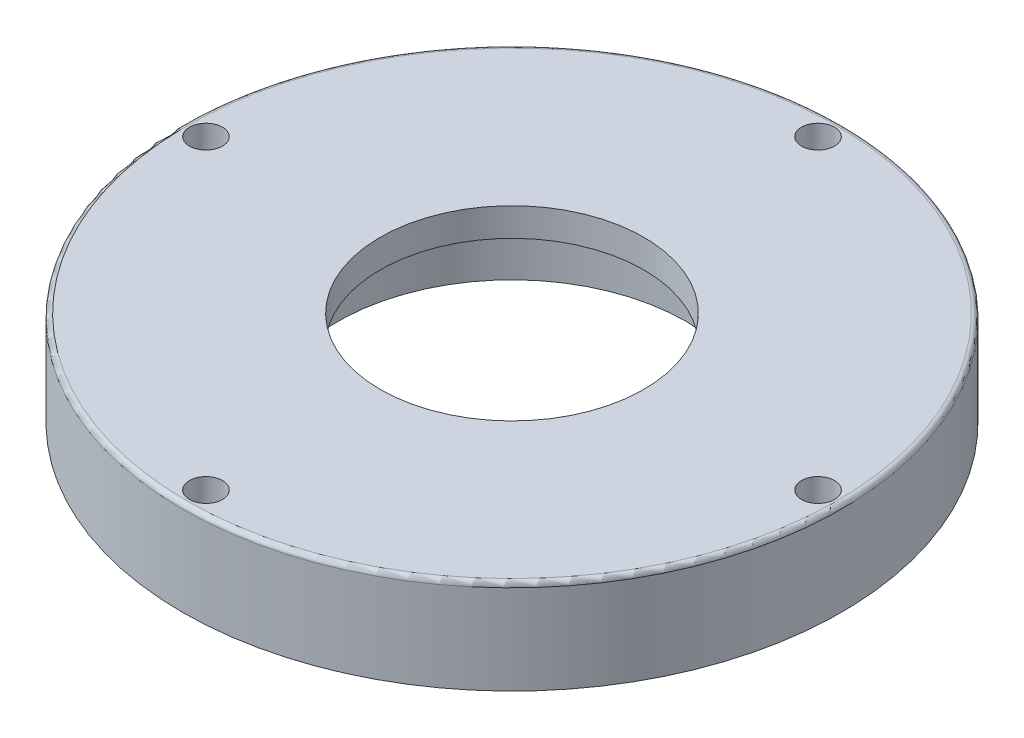
ISO-10303-21;
HEADER;
FILE_DESCRIPTION(('STEP AP214'),'2;1');
FILE_NAME('part.step','',(''),(''),'','','');
FILE_SCHEMA(('AUTOMOTIVE_DESIGN { 1 0 10303 214 1 1 1 1 }'));
ENDSEC;
DATA;
#1=APPLICATION_CONTEXT('core data for automotive mechanical design processes');
#2=APPLICATION_PROTOCOL_DEFINITION('international standard','automotive_design',2000,#1);
#3=PRODUCT_CONTEXT('',#1,'mechanical');
#4=PRODUCT('Part','Part','',(#3));
#5=PRODUCT_RELATED_PRODUCT_CATEGORY('part','',(#4));
#6=PRODUCT_DEFINITION_FORMATION('','',#4);
#7=PRODUCT_DEFINITION_CONTEXT('part definition',#1,'design');
#8=PRODUCT_DEFINITION('design','',#6,#7);
#9=PRODUCT_DEFINITION_SHAPE('','',#8);
#10=(LENGTH_UNIT() NAMED_UNIT(*) SI_UNIT(.MILLI.,.METRE.));
#11=(NAMED_UNIT(*) PLANE_ANGLE_UNIT() SI_UNIT($,.RADIAN.));
#12=(NAMED_UNIT(*) SI_UNIT($,.STERADIAN.) SOLID_ANGLE_UNIT());
#13=UNCERTAINTY_MEASURE_WITH_UNIT(LENGTH_MEASURE(1.E-05),#10,'distance_accuracy_value','');
#14=(GEOMETRIC_REPRESENTATION_CONTEXT(3) GLOBAL_UNCERTAINTY_ASSIGNED_CONTEXT((#13)) GLOBAL_UNIT_ASSIGNED_CONTEXT((#10,
#11,#12)) REPRESENTATION_CONTEXT('',''));
#15=CARTESIAN_POINT('',(0.,0.,0.));
#16=DIRECTION('',(0.,0.,1.));
#17=DIRECTION('',(1.,0.,0.));
#18=AXIS2_PLACEMENT_3D('',#15,#16,#17);
#19=CARTESIAN_POINT('',(0.,10.,0.));
#20=DIRECTION('',(0.,-1.,0.));
#21=DIRECTION('',(0.,0.,-1.));
#22=AXIS2_PLACEMENT_3D('',#19,#20,#21);
#23=CYLINDRICAL_SURFACE('',#22,35.);
#24=CARTESIAN_POINT('',(0.,9.5,0.));
#25=DIRECTION('',(0.,1.,0.));
#26=DIRECTION('',(0.,0.,1.));
#27=AXIS2_PLACEMENT_3D('',#24,#25,#26);
#28=CIRCLE('',#27,35.);
#29=CARTESIAN_POINT('',(0.,9.5,35.));
#30=VERTEX_POINT('',#29);
#31=EDGE_CURVE('E10',#30,#30,#28,.F.);
#32=ORIENTED_EDGE('',*,*,#31,.T.);
#33=EDGE_LOOP('',(#32));
#34=FACE_BOUND('',#33,.T.);
#35=CARTESIAN_POINT('',(0.,0.,0.));
#36=DIRECTION('',(0.,1.,0.));
#37=DIRECTION('',(0.,0.,1.));
#38=AXIS2_PLACEMENT_3D('',#35,#36,#37);
#39=CIRCLE('',#38,35.);
#40=CARTESIAN_POINT('',(0.,0.,35.));
#41=VERTEX_POINT('',#40);
#42=EDGE_CURVE('E45',#41,#41,#39,.T.);
#43=ORIENTED_EDGE('',*,*,#42,.T.);
#44=EDGE_LOOP('',(#43));
#45=FACE_BOUND('',#44,.T.);
#46=ADVANCED_FACE('F34',(#34,#45),#23,.T.);
#47=CARTESIAN_POINT('',(0.,10.,0.));
#48=DIRECTION('',(0.,1.,0.));
#49=DIRECTION('',(0.,0.,1.));
#50=AXIS2_PLACEMENT_3D('',#47,#48,#49);
#51=PLANE('',#50);
#52=CARTESIAN_POINT('',(0.,10.,0.));
#53=DIRECTION('',(0.,1.,0.));
#54=DIRECTION('',(0.,0.,1.));
#55=AXIS2_PLACEMENT_3D('',#52,#53,#54);
#56=CIRCLE('',#55,34.5);
#57=CARTESIAN_POINT('',(0.,10.,34.5));
#58=VERTEX_POINT('',#57);
#59=EDGE_CURVE('E41',#58,#58,#56,.T.);
#60=ORIENTED_EDGE('',*,*,#59,.T.);
#61=EDGE_LOOP('',(#60));
#62=FACE_BOUND('',#61,.T.);
#63=CARTESIAN_POINT('',(0.,10.,0.));
#64=DIRECTION('',(0.,1.,0.));
#65=DIRECTION('',(0.,0.,1.));
#66=AXIS2_PLACEMENT_3D('',#63,#64,#65);
#67=CIRCLE('',#66,14.);
#68=CARTESIAN_POINT('',(0.,10.,14.));
#69=VERTEX_POINT('',#68);
#70=EDGE_CURVE('E55',#69,#69,#67,.T.);
#71=ORIENTED_EDGE('',*,*,#70,.F.);
#72=EDGE_LOOP('',(#71));
#73=FACE_BOUND('',#72,.T.);
#74=CARTESIAN_POINT('',(0.,10.,-32.5));
#75=DIRECTION('',(0.,1.,0.));
#76=DIRECTION('',(0.,0.,1.));
#77=AXIS2_PLACEMENT_3D('',#74,#75,#76);
#78=CIRCLE('',#77,1.75);
#79=CARTESIAN_POINT('',(0.,10.,-30.75));
#80=VERTEX_POINT('',#79);
#81=EDGE_CURVE('E76',#80,#80,#78,.T.);
#82=ORIENTED_EDGE('',*,*,#81,.F.);
#83=EDGE_LOOP('',(#82));
#84=FACE_BOUND('',#83,.T.);
#85=CARTESIAN_POINT('',(32.5,10.,0.));
#86=DIRECTION('',(0.,1.,0.));
#87=DIRECTION('',(0.,0.,1.));
#88=AXIS2_PLACEMENT_3D('',#85,#86,#87);
#89=CIRCLE('',#88,1.75);
#90=CARTESIAN_POINT('',(32.5,10.,1.75));
#91=VERTEX_POINT('',#90);
#92=EDGE_CURVE('E70',#91,#91,#89,.T.);
#93=ORIENTED_EDGE('',*,*,#92,.F.);
#94=EDGE_LOOP('',(#93));
#95=FACE_BOUND('',#94,.T.);
#96=CARTESIAN_POINT('',(0.,10.,32.5));
#97=DIRECTION('',(0.,1.,0.));
#98=DIRECTION('',(0.,0.,1.));
#99=AXIS2_PLACEMENT_3D('',#96,#97,#98);
#100=CIRCLE('',#99,1.75);
#101=CARTESIAN_POINT('',(0.,10.,34.25));
#102=VERTEX_POINT('',#101);
#103=EDGE_CURVE('E64',#102,#102,#100,.T.);
#104=ORIENTED_EDGE('',*,*,#103,.F.);
#105=EDGE_LOOP('',(#104));
#106=FACE_BOUND('',#105,.T.);
#107=CARTESIAN_POINT('',(-32.5,10.,0.));
#108=DIRECTION('',(0.,1.,0.));
#109=DIRECTION('',(0.,0.,1.));
#110=AXIS2_PLACEMENT_3D('',#107,#108,#109);
#111=CIRCLE('',#110,1.75);
#112=CARTESIAN_POINT('',(-32.5,10.,1.75000000000001));
#113=VERTEX_POINT('',#112);
#114=EDGE_CURVE('E57',#113,#113,#111,.T.);
#115=ORIENTED_EDGE('',*,*,#114,.F.);
#116=EDGE_LOOP('',(#115));
#117=FACE_BOUND('',#116,.T.);
#118=ADVANCED_FACE('F90',(#62,#73,#84,#95,#106,#117),#51,.T.);
#119=CARTESIAN_POINT('',(0.,0.,0.));
#120=DIRECTION('',(0.,1.,0.));
#121=DIRECTION('',(0.,0.,1.));
#122=AXIS2_PLACEMENT_3D('',#119,#120,#121);
#123=PLANE('',#122);
#124=CARTESIAN_POINT('',(0.,0.,0.));
#125=DIRECTION('',(0.,-1.,0.));
#126=DIRECTION('',(0.,0.,-1.));
#127=AXIS2_PLACEMENT_3D('',#124,#125,#126);
#128=CIRCLE('',#127,18.5);
#129=CARTESIAN_POINT('',(0.,0.,-18.5));
#130=VERTEX_POINT('',#129);
#131=EDGE_CURVE('E54',#130,#130,#128,.T.);
#132=ORIENTED_EDGE('',*,*,#131,.F.);
#133=EDGE_LOOP('',(#132));
#134=FACE_BOUND('',#133,.T.);
#135=CARTESIAN_POINT('',(0.,0.,-32.5));
#136=DIRECTION('',(0.,1.,0.));
#137=DIRECTION('',(0.,0.,1.));
#138=AXIS2_PLACEMENT_3D('',#135,#136,#137);
#139=CIRCLE('',#138,1.75);
#140=CARTESIAN_POINT('',(0.,0.,-30.75));
#141=VERTEX_POINT('',#140);
#142=EDGE_CURVE('E49',#141,#141,#139,.T.);
#143=ORIENTED_EDGE('',*,*,#142,.T.);
#144=EDGE_LOOP('',(#143));
#145=FACE_BOUND('',#144,.T.);
#146=CARTESIAN_POINT('',(32.5,0.,0.));
#147=DIRECTION('',(0.,1.,0.));
#148=DIRECTION('',(0.,0.,1.));
#149=AXIS2_PLACEMENT_3D('',#146,#147,#148);
#150=CIRCLE('',#149,1.75);
#151=CARTESIAN_POINT('',(32.5,0.,1.75));
#152=VERTEX_POINT('',#151);
#153=EDGE_CURVE('E73',#152,#152,#150,.T.);
#154=ORIENTED_EDGE('',*,*,#153,.T.);
#155=EDGE_LOOP('',(#154));
#156=FACE_BOUND('',#155,.T.);
#157=CARTESIAN_POINT('',(0.,0.,32.5));
#158=DIRECTION('',(0.,1.,0.));
#159=DIRECTION('',(0.,0.,1.));
#160=AXIS2_PLACEMENT_3D('',#157,#158,#159);
#161=CIRCLE('',#160,1.75);
#162=CARTESIAN_POINT('',(0.,0.,34.25));
#163=VERTEX_POINT('',#162);
#164=EDGE_CURVE('E67',#163,#163,#161,.T.);
#165=ORIENTED_EDGE('',*,*,#164,.T.);
#166=EDGE_LOOP('',(#165));
#167=FACE_BOUND('',#166,.T.);
#168=CARTESIAN_POINT('',(-32.5,0.,0.));
#169=DIRECTION('',(0.,1.,0.));
#170=DIRECTION('',(0.,0.,1.));
#171=AXIS2_PLACEMENT_3D('',#168,#169,#170);
#172=CIRCLE('',#171,1.75);
#173=CARTESIAN_POINT('',(-32.5,0.,1.75000000000001));
#174=VERTEX_POINT('',#173);
#175=EDGE_CURVE('E60',#174,#174,#172,.T.);
#176=ORIENTED_EDGE('',*,*,#175,.T.);
#177=EDGE_LOOP('',(#176));
#178=FACE_BOUND('',#177,.T.);
#179=ORIENTED_EDGE('',*,*,#42,.F.);
#180=EDGE_LOOP('',(#179));
#181=FACE_BOUND('',#180,.T.);
#182=ADVANCED_FACE('F93',(#134,#145,#156,#167,#178,#181),#123,.F.);
#183=CARTESIAN_POINT('',(-32.5,0.,0.));
#184=DIRECTION('',(0.,1.,0.));
#185=DIRECTION('',(0.,0.,1.));
#186=AXIS2_PLACEMENT_3D('',#183,#184,#185);
#187=CYLINDRICAL_SURFACE('',#186,1.75);
#188=ORIENTED_EDGE('',*,*,#175,.F.);
#189=EDGE_LOOP('',(#188));
#190=FACE_BOUND('',#189,.T.);
#191=ORIENTED_EDGE('',*,*,#114,.T.);
#192=EDGE_LOOP('',(#191));
#193=FACE_BOUND('',#192,.T.);
#194=ADVANCED_FACE('F103',(#190,#193),#187,.F.);
#195=CARTESIAN_POINT('',(0.,0.,32.5));
#196=DIRECTION('',(0.,1.,0.));
#197=DIRECTION('',(0.,0.,1.));
#198=AXIS2_PLACEMENT_3D('',#195,#196,#197);
#199=CYLINDRICAL_SURFACE('',#198,1.75);
#200=ORIENTED_EDGE('',*,*,#164,.F.);
#201=EDGE_LOOP('',(#200));
#202=FACE_BOUND('',#201,.T.);
#203=ORIENTED_EDGE('',*,*,#103,.T.);
#204=EDGE_LOOP('',(#203));
#205=FACE_BOUND('',#204,.T.);
#206=ADVANCED_FACE('F105',(#202,#205),#199,.F.);
#207=CARTESIAN_POINT('',(32.5,0.,0.));
#208=DIRECTION('',(0.,1.,0.));
#209=DIRECTION('',(0.,0.,1.));
#210=AXIS2_PLACEMENT_3D('',#207,#208,#209);
#211=CYLINDRICAL_SURFACE('',#210,1.75);
#212=ORIENTED_EDGE('',*,*,#153,.F.);
#213=EDGE_LOOP('',(#212));
#214=FACE_BOUND('',#213,.T.);
#215=ORIENTED_EDGE('',*,*,#92,.T.);
#216=EDGE_LOOP('',(#215));
#217=FACE_BOUND('',#216,.T.);
#218=ADVANCED_FACE('F112',(#214,#217),#211,.F.);
#219=CARTESIAN_POINT('',(0.,0.,-32.5));
#220=DIRECTION('',(0.,1.,0.));
#221=DIRECTION('',(0.,0.,1.));
#222=AXIS2_PLACEMENT_3D('',#219,#220,#221);
#223=CYLINDRICAL_SURFACE('',#222,1.75);
#224=ORIENTED_EDGE('',*,*,#142,.F.);
#225=EDGE_LOOP('',(#224));
#226=FACE_BOUND('',#225,.T.);
#227=ORIENTED_EDGE('',*,*,#81,.T.);
#228=EDGE_LOOP('',(#227));
#229=FACE_BOUND('',#228,.T.);
#230=ADVANCED_FACE('F141',(#226,#229),#223,.F.);
#231=CARTESIAN_POINT('',(0.,7.,0.));
#232=DIRECTION('',(0.,-1.,0.));
#233=DIRECTION('',(0.,0.,-1.));
#234=AXIS2_PLACEMENT_3D('',#231,#232,#233);
#235=CYLINDRICAL_SURFACE('',#234,18.5);
#236=CARTESIAN_POINT('',(0.,7.,0.));
#237=DIRECTION('',(0.,-1.,0.));
#238=DIRECTION('',(0.,0.,-1.));
#239=AXIS2_PLACEMENT_3D('',#236,#237,#238);
#240=CIRCLE('',#239,18.5);
#241=CARTESIAN_POINT('',(0.,7.,-18.5));
#242=VERTEX_POINT('',#241);
#243=EDGE_CURVE('E61',#242,#242,#240,.T.);
#244=ORIENTED_EDGE('',*,*,#243,.F.);
#245=EDGE_LOOP('',(#244));
#246=FACE_BOUND('',#245,.T.);
#247=ORIENTED_EDGE('',*,*,#131,.T.);
#248=EDGE_LOOP('',(#247));
#249=FACE_BOUND('',#248,.T.);
#250=ADVANCED_FACE('F146',(#246,#249),#235,.F.);
#251=CARTESIAN_POINT('',(0.,7.,0.));
#252=DIRECTION('',(0.,-1.,0.));
#253=DIRECTION('',(0.,0.,-1.));
#254=AXIS2_PLACEMENT_3D('',#251,#252,#253);
#255=PLANE('',#254);
#256=CARTESIAN_POINT('',(0.,7.,0.));
#257=DIRECTION('',(0.,-1.,0.));
#258=DIRECTION('',(0.,0.,-1.));
#259=AXIS2_PLACEMENT_3D('',#256,#257,#258);
#260=CIRCLE('',#259,14.);
#261=CARTESIAN_POINT('',(0.,7.,-14.));
#262=VERTEX_POINT('',#261);
#263=EDGE_CURVE('E52',#262,#262,#260,.T.);
#264=ORIENTED_EDGE('',*,*,#263,.F.);
#265=EDGE_LOOP('',(#264));
#266=FACE_BOUND('',#265,.T.);
#267=ORIENTED_EDGE('',*,*,#243,.T.);
#268=EDGE_LOOP('',(#267));
#269=FACE_BOUND('',#268,.T.);
#270=ADVANCED_FACE('F151',(#266,#269),#255,.T.);
#271=CARTESIAN_POINT('',(0.,0.,0.));
#272=DIRECTION('',(0.,1.,0.));
#273=DIRECTION('',(0.,0.,1.));
#274=AXIS2_PLACEMENT_3D('',#271,#272,#273);
#275=CYLINDRICAL_SURFACE('',#274,14.);
#276=ORIENTED_EDGE('',*,*,#263,.T.);
#277=EDGE_LOOP('',(#276));
#278=FACE_BOUND('',#277,.T.);
#279=ORIENTED_EDGE('',*,*,#70,.T.);
#280=EDGE_LOOP('',(#279));
#281=FACE_BOUND('',#280,.T.);
#282=ADVANCED_FACE('F88',(#278,#281),#275,.F.);
#283=CARTESIAN_POINT('',(0.,9.5,0.));
#284=DIRECTION('',(0.,1.,0.));
#285=DIRECTION('',(0.,0.,1.));
#286=AXIS2_PLACEMENT_3D('',#283,#284,#285);
#287=TOROIDAL_SURFACE('',#286,34.5,0.5);
#288=ORIENTED_EDGE('',*,*,#31,.F.);
#289=EDGE_LOOP('',(#288));
#290=FACE_BOUND('',#289,.T.);
#291=ORIENTED_EDGE('',*,*,#59,.F.);
#292=EDGE_LOOP('',(#291));
#293=FACE_BOUND('',#292,.T.);
#294=ADVANCED_FACE('F36',(#290,#293),#287,.T.);
#295=CLOSED_SHELL('',(#46,#118,#182,#194,#206,#218,#230,#250,#270,#282,#294));
#296=MANIFOLD_SOLID_BREP('B2',#295);
#297=ADVANCED_BREP_SHAPE_REPRESENTATION('',(#18,#296),#14);
#298=SHAPE_DEFINITION_REPRESENTATION(#9,#297);
ENDSEC;
END-ISO-10303-21;
